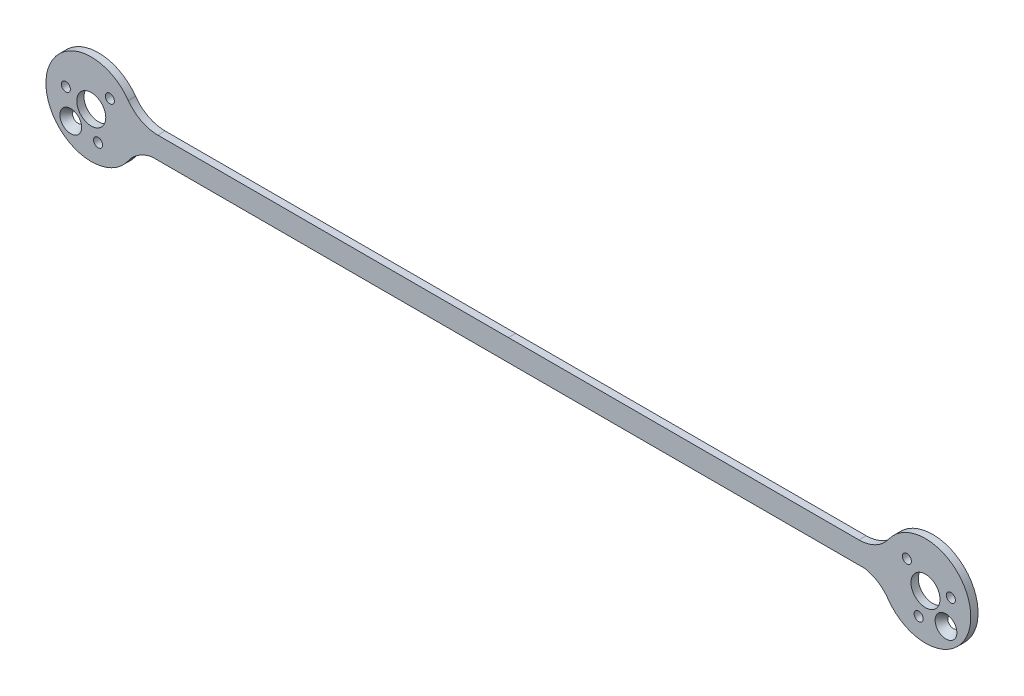
ISO-10303-21;
HEADER;
FILE_DESCRIPTION(('STEP AP214'),'2;1');
FILE_NAME('part.step','',(''),(''),'','','');
FILE_SCHEMA(('AUTOMOTIVE_DESIGN { 1 0 10303 214 1 1 1 1 }'));
ENDSEC;
DATA;
#1=APPLICATION_CONTEXT('core data for automotive mechanical design processes');
#2=APPLICATION_PROTOCOL_DEFINITION('international standard','automotive_design',2000,#1);
#3=PRODUCT_CONTEXT('',#1,'mechanical');
#4=PRODUCT('Part','Part','',(#3));
#5=PRODUCT_RELATED_PRODUCT_CATEGORY('part','',(#4));
#6=PRODUCT_DEFINITION_FORMATION('','',#4);
#7=PRODUCT_DEFINITION_CONTEXT('part definition',#1,'design');
#8=PRODUCT_DEFINITION('design','',#6,#7);
#9=PRODUCT_DEFINITION_SHAPE('','',#8);
#10=(LENGTH_UNIT() NAMED_UNIT(*) SI_UNIT(.MILLI.,.METRE.));
#11=(NAMED_UNIT(*) PLANE_ANGLE_UNIT() SI_UNIT($,.RADIAN.));
#12=(NAMED_UNIT(*) SI_UNIT($,.STERADIAN.) SOLID_ANGLE_UNIT());
#13=UNCERTAINTY_MEASURE_WITH_UNIT(LENGTH_MEASURE(1.E-05),#10,'distance_accuracy_value','');
#14=(GEOMETRIC_REPRESENTATION_CONTEXT(3) GLOBAL_UNCERTAINTY_ASSIGNED_CONTEXT((#13)) GLOBAL_UNIT_ASSIGNED_CONTEXT((#10,
#11,#12)) REPRESENTATION_CONTEXT('',''));
#15=CARTESIAN_POINT('',(0.,0.,0.));
#16=DIRECTION('',(0.,0.,1.));
#17=DIRECTION('',(1.,0.,0.));
#18=AXIS2_PLACEMENT_3D('',#15,#16,#17);
#19=CARTESIAN_POINT('',(-97.5569979375162,13.0225534607483,2.));
#20=DIRECTION('',(0.,0.,-1.));
#21=DIRECTION('',(-1.,0.,0.));
#22=AXIS2_PLACEMENT_3D('',#19,#20,#21);
#23=CYLINDRICAL_SURFACE('',#22,9.99999999999986);
#24=CARTESIAN_POINT('',(-97.5569979375162,13.0225534607483,0.));
#25=DIRECTION('',(0.,0.,1.));
#26=DIRECTION('',(1.,0.,0.));
#27=AXIS2_PLACEMENT_3D('',#24,#25,#26);
#28=CIRCLE('',#27,9.99999999999986);
#29=CARTESIAN_POINT('',(-105.718905786531,7.24472858765025,0.));
#30=VERTEX_POINT('',#29);
#31=CARTESIAN_POINT('',(-97.556989056457,3.02255346075242,0.));
#32=VERTEX_POINT('',#31);
#33=EDGE_CURVE('E174',#30,#32,#28,.T.);
#34=ORIENTED_EDGE('',*,*,#33,.F.);
#35=DIRECTION('',(0.,0.,-1.));
#36=VECTOR('',#35,1.);
#37=CARTESIAN_POINT('',(-105.718905786531,7.24472858765025,2.));
#38=LINE('',#37,#36);
#39=CARTESIAN_POINT('',(-105.718905786531,7.24472858765025,2.));
#40=VERTEX_POINT('',#39);
#41=EDGE_CURVE('E100',#40,#30,#38,.T.);
#42=ORIENTED_EDGE('',*,*,#41,.F.);
#43=CARTESIAN_POINT('',(-97.5569979375162,13.0225534607483,2.));
#44=DIRECTION('',(0.,0.,1.));
#45=DIRECTION('',(1.,0.,0.));
#46=AXIS2_PLACEMENT_3D('',#43,#44,#45);
#47=CIRCLE('',#46,9.99999999999986);
#48=CARTESIAN_POINT('',(-97.556989056457,3.02255346075242,2.));
#49=VERTEX_POINT('',#48);
#50=EDGE_CURVE('E315',#40,#49,#47,.T.);
#51=ORIENTED_EDGE('',*,*,#50,.T.);
#52=DIRECTION('',(0.,0.,-1.));
#53=VECTOR('',#52,1.);
#54=CARTESIAN_POINT('',(-97.556989056457,3.02255346075242,2.));
#55=LINE('',#54,#53);
#56=EDGE_CURVE('E96',#49,#32,#55,.T.);
#57=ORIENTED_EDGE('',*,*,#56,.T.);
#58=EDGE_LOOP('',(#34,#42,#51,#57));
#59=FACE_BOUND('',#58,.T.);
#60=ADVANCED_FACE('F37',(#59),#23,.F.);
#61=CARTESIAN_POINT('',(-115.921163948581,0.0225371514186672,2.));
#62=DIRECTION('',(0.,0.,-1.));
#63=DIRECTION('',(-1.,0.,0.));
#64=AXIS2_PLACEMENT_3D('',#61,#62,#63);
#65=CYLINDRICAL_SURFACE('',#64,12.4998448289046);
#66=CARTESIAN_POINT('',(-115.921163948581,0.0225371514186672,0.));
#67=DIRECTION('',(0.,0.,1.));
#68=DIRECTION('',(1.,0.,0.));
#69=AXIS2_PLACEMENT_3D('',#66,#67,#68);
#70=CIRCLE('',#69,12.4998448289046);
#71=CARTESIAN_POINT('',(-105.660502287007,-7.11643637517478,0.));
#72=VERTEX_POINT('',#71);
#73=EDGE_CURVE('E176',#30,#72,#70,.T.);
#74=ORIENTED_EDGE('',*,*,#73,.T.);
#75=DIRECTION('',(0.,0.,-1.));
#76=VECTOR('',#75,1.);
#77=CARTESIAN_POINT('',(-105.660502287007,-7.11643637517478,2.));
#78=LINE('',#77,#76);
#79=CARTESIAN_POINT('',(-105.660502287007,-7.11643637517478,2.));
#80=VERTEX_POINT('',#79);
#81=EDGE_CURVE('E217',#80,#72,#78,.T.);
#82=ORIENTED_EDGE('',*,*,#81,.F.);
#83=CARTESIAN_POINT('',(-115.921163948581,0.0225371514186672,2.));
#84=DIRECTION('',(0.,0.,1.));
#85=DIRECTION('',(1.,0.,0.));
#86=AXIS2_PLACEMENT_3D('',#83,#84,#85);
#87=CIRCLE('',#86,12.4998448289046);
#88=EDGE_CURVE('E312',#40,#80,#87,.T.);
#89=ORIENTED_EDGE('',*,*,#88,.F.);
#90=ORIENTED_EDGE('',*,*,#41,.T.);
#91=EDGE_LOOP('',(#74,#82,#89,#90));
#92=FACE_BOUND('',#91,.T.);
#93=ADVANCED_FACE('F243',(#92),#65,.T.);
#94=CARTESIAN_POINT('',(-97.4518710583645,-12.8276860941199,2.));
#95=DIRECTION('',(0.,0.,-1.));
#96=DIRECTION('',(-1.,0.,0.));
#97=AXIS2_PLACEMENT_3D('',#94,#95,#96);
#98=CYLINDRICAL_SURFACE('',#97,9.99999999999994);
#99=CARTESIAN_POINT('',(-97.4518710583645,-12.8276860941199,0.));
#100=DIRECTION('',(0.,0.,1.));
#101=DIRECTION('',(1.,0.,0.));
#102=AXIS2_PLACEMENT_3D('',#99,#100,#101);
#103=CIRCLE('',#102,9.99999999999994);
#104=CARTESIAN_POINT('',(-99.1760546445944,-2.97744797715167,0.));
#105=VERTEX_POINT('',#104);
#106=EDGE_CURVE('E179',#105,#72,#103,.T.);
#107=ORIENTED_EDGE('',*,*,#106,.F.);
#108=DIRECTION('',(0.,0.,-1.));
#109=VECTOR('',#108,1.);
#110=CARTESIAN_POINT('',(-99.1760546445944,-2.97744797715167,2.));
#111=LINE('',#110,#109);
#112=CARTESIAN_POINT('',(-99.1760546445944,-2.97744797715167,2.));
#113=VERTEX_POINT('',#112);
#114=EDGE_CURVE('E215',#113,#105,#111,.T.);
#115=ORIENTED_EDGE('',*,*,#114,.F.);
#116=CARTESIAN_POINT('',(-97.4518710583645,-12.8276860941199,2.));
#117=DIRECTION('',(0.,0.,1.));
#118=DIRECTION('',(1.,0.,0.));
#119=AXIS2_PLACEMENT_3D('',#116,#117,#118);
#120=CIRCLE('',#119,9.99999999999994);
#121=EDGE_CURVE('E314',#113,#80,#120,.T.);
#122=ORIENTED_EDGE('',*,*,#121,.T.);
#123=ORIENTED_EDGE('',*,*,#81,.T.);
#124=EDGE_LOOP('',(#107,#115,#122,#123));
#125=FACE_BOUND('',#124,.T.);
#126=ADVANCED_FACE('F248',(#125),#98,.F.);
#127=CARTESIAN_POINT('',(2.64421095709354E-06,-2.97735989830789,2.));
#128=DIRECTION('',(-8.8810592182533E-07,0.999999999999606,0.));
#129=DIRECTION('',(-0.999999999999606,-8.88105921825331E-07,0.));
#130=AXIS2_PLACEMENT_3D('',#127,#128,#129);
#131=PLANE('',#130);
#132=DIRECTION('',(0.999999999999606,8.8810592182533E-07,0.));
#133=VECTOR('',#132,1.);
#134=CARTESIAN_POINT('',(2.64421095709354E-06,-2.97735989830789,0.));
#135=LINE('',#134,#133);
#136=CARTESIAN_POINT('',(-0.921276729477011,-2.97736071650156,0.));
#137=VERTEX_POINT('',#136);
#138=EDGE_CURVE('E182',#105,#137,#135,.T.);
#139=ORIENTED_EDGE('',*,*,#138,.T.);
#140=DIRECTION('',(0.,0.,-1.));
#141=VECTOR('',#140,1.);
#142=CARTESIAN_POINT('',(-0.921276729477011,-2.97736071650156,2.));
#143=LINE('',#142,#141);
#144=CARTESIAN_POINT('',(-0.921276729477011,-2.97736071650156,2.));
#145=VERTEX_POINT('',#144);
#146=EDGE_CURVE('E212',#145,#137,#143,.T.);
#147=ORIENTED_EDGE('',*,*,#146,.F.);
#148=DIRECTION('',(0.999999999999606,8.8810592182533E-07,0.));
#149=VECTOR('',#148,1.);
#150=CARTESIAN_POINT('',(2.64421095709354E-06,-2.97735989830789,2.));
#151=LINE('',#150,#149);
#152=EDGE_CURVE('E325',#113,#145,#151,.T.);
#153=ORIENTED_EDGE('',*,*,#152,.F.);
#154=ORIENTED_EDGE('',*,*,#114,.T.);
#155=EDGE_LOOP('',(#139,#147,#153,#154));
#156=FACE_BOUND('',#155,.T.);
#157=ADVANCED_FACE('F353',(#156),#131,.F.);
#158=CARTESIAN_POINT('',(3.42803572160413E-06,-2.97735965576934,2.));
#159=DIRECTION('',(-1.15136769417804E-06,0.999999999999337,0.));
#160=DIRECTION('',(-0.999999999999337,-1.15136769417804E-06,0.));
#161=AXIS2_PLACEMENT_3D('',#158,#159,#160);
#162=PLANE('',#161);
#163=DIRECTION('',(0.999999999999337,1.15136769417804E-06,0.));
#164=VECTOR('',#163,1.);
#165=CARTESIAN_POINT('',(3.42803572160413E-06,-2.97735965576934,0.));
#166=LINE('',#165,#164);
#167=CARTESIAN_POINT('',(97.333501185614,-2.97724758912446,0.));
#168=VERTEX_POINT('',#167);
#169=EDGE_CURVE('E185',#137,#168,#166,.T.);
#170=ORIENTED_EDGE('',*,*,#169,.T.);
#171=DIRECTION('',(0.,0.,-1.));
#172=VECTOR('',#171,1.);
#173=CARTESIAN_POINT('',(97.333501185614,-2.97724758912446,2.));
#174=LINE('',#173,#172);
#175=CARTESIAN_POINT('',(97.333501185614,-2.97724758912446,2.));
#176=VERTEX_POINT('',#175);
#177=EDGE_CURVE('E210',#176,#168,#174,.T.);
#178=ORIENTED_EDGE('',*,*,#177,.F.);
#179=DIRECTION('',(0.999999999999337,1.15136769417804E-06,0.));
#180=VECTOR('',#179,1.);
#181=CARTESIAN_POINT('',(3.42803572160413E-06,-2.97735965576934,2.));
#182=LINE('',#181,#180);
#183=EDGE_CURVE('E328',#145,#176,#182,.T.);
#184=ORIENTED_EDGE('',*,*,#183,.F.);
#185=ORIENTED_EDGE('',*,*,#146,.T.);
#186=EDGE_LOOP('',(#170,#178,#184,#185));
#187=FACE_BOUND('',#186,.T.);
#188=ADVANCED_FACE('F337',(#187),#162,.F.);
#189=CARTESIAN_POINT('',(95.6093376886885,-12.8274892224992,2.));
#190=DIRECTION('',(0.,0.,-1.));
#191=DIRECTION('',(-1.,0.,0.));
#192=AXIS2_PLACEMENT_3D('',#189,#190,#191);
#193=CYLINDRICAL_SURFACE('',#192,9.99999999999995);
#194=CARTESIAN_POINT('',(95.6093376886885,-12.8274892224992,0.));
#195=DIRECTION('',(0.,0.,1.));
#196=DIRECTION('',(1.,0.,0.));
#197=AXIS2_PLACEMENT_3D('',#194,#195,#196);
#198=CIRCLE('',#197,9.99999999999995);
#199=CARTESIAN_POINT('',(103.817957269371,-7.11622276227923,0.));
#200=VERTEX_POINT('',#199);
#201=EDGE_CURVE('E188',#200,#168,#198,.T.);
#202=ORIENTED_EDGE('',*,*,#201,.F.);
#203=DIRECTION('',(0.,0.,-1.));
#204=VECTOR('',#203,1.);
#205=CARTESIAN_POINT('',(103.817957269371,-7.11622276227923,2.));
#206=LINE('',#205,#204);
#207=CARTESIAN_POINT('',(103.817957269371,-7.11622276227923,2.));
#208=VERTEX_POINT('',#207);
#209=EDGE_CURVE('E208',#208,#200,#206,.T.);
#210=ORIENTED_EDGE('',*,*,#209,.F.);
#211=CARTESIAN_POINT('',(95.6093376886885,-12.8274892224992,2.));
#212=DIRECTION('',(0.,0.,1.));
#213=DIRECTION('',(1.,0.,0.));
#214=AXIS2_PLACEMENT_3D('',#211,#212,#213);
#215=CIRCLE('',#214,9.99999999999995);
#216=EDGE_CURVE('E145',#208,#176,#215,.T.);
#217=ORIENTED_EDGE('',*,*,#216,.T.);
#218=ORIENTED_EDGE('',*,*,#177,.T.);
#219=EDGE_LOOP('',(#202,#210,#217,#218));
#220=FACE_BOUND('',#219,.T.);
#221=ADVANCED_FACE('F332',(#220),#193,.F.);
#222=CARTESIAN_POINT('',(114.078604371175,0.0227716906485944,2.));
#223=DIRECTION('',(0.,0.,-1.));
#224=DIRECTION('',(-1.,0.,0.));
#225=AXIS2_PLACEMENT_3D('',#222,#223,#224);
#226=CYLINDRICAL_SURFACE('',#225,12.4998448289045);
#227=CARTESIAN_POINT('',(114.078604371175,0.0227716906485944,0.));
#228=DIRECTION('',(0.,0.,1.));
#229=DIRECTION('',(1.,0.,0.));
#230=AXIS2_PLACEMENT_3D('',#227,#228,#229);
#231=CIRCLE('',#230,12.4998448289045);
#232=CARTESIAN_POINT('',(103.876331479677,7.2449423196281,0.));
#233=VERTEX_POINT('',#232);
#234=EDGE_CURVE('E191',#200,#233,#231,.T.);
#235=ORIENTED_EDGE('',*,*,#234,.T.);
#236=DIRECTION('',(0.,0.,-1.));
#237=VECTOR('',#236,1.);
#238=CARTESIAN_POINT('',(103.876331479677,7.2449423196281,2.));
#239=LINE('',#238,#237);
#240=CARTESIAN_POINT('',(103.876331479677,7.2449423196281,2.));
#241=VERTEX_POINT('',#240);
#242=EDGE_CURVE('E132',#241,#233,#239,.T.);
#243=ORIENTED_EDGE('',*,*,#242,.F.);
#244=CARTESIAN_POINT('',(114.078604371175,0.0227716906485944,2.));
#245=DIRECTION('',(0.,0.,1.));
#246=DIRECTION('',(1.,0.,0.));
#247=AXIS2_PLACEMENT_3D('',#244,#245,#246);
#248=CIRCLE('',#247,12.4998448289045);
#249=EDGE_CURVE('E142',#208,#241,#248,.T.);
#250=ORIENTED_EDGE('',*,*,#249,.F.);
#251=ORIENTED_EDGE('',*,*,#209,.T.);
#252=EDGE_LOOP('',(#235,#243,#250,#251));
#253=FACE_BOUND('',#252,.T.);
#254=ADVANCED_FACE('F340',(#253),#226,.T.);
#255=CARTESIAN_POINT('',(95.7144118469584,13.0227505467189,2.));
#256=DIRECTION('',(0.,0.,-1.));
#257=DIRECTION('',(-1.,0.,0.));
#258=AXIS2_PLACEMENT_3D('',#255,#256,#257);
#259=CYLINDRICAL_SURFACE('',#258,10.0000000000002);
#260=CARTESIAN_POINT('',(95.7144118469584,13.0227505467189,0.));
#261=DIRECTION('',(0.,0.,1.));
#262=DIRECTION('',(1.,0.,0.));
#263=AXIS2_PLACEMENT_3D('',#260,#261,#262);
#264=CIRCLE('',#263,10.0000000000002);
#265=CARTESIAN_POINT('',(95.7144233606354,3.02275054672531,0.));
#266=VERTEX_POINT('',#265);
#267=EDGE_CURVE('E129',#266,#233,#264,.T.);
#268=ORIENTED_EDGE('',*,*,#267,.F.);
#269=DIRECTION('',(0.,0.,-1.));
#270=VECTOR('',#269,1.);
#271=CARTESIAN_POINT('',(95.7144233606354,3.02275054672531,2.));
#272=LINE('',#271,#270);
#273=CARTESIAN_POINT('',(95.7144233606354,3.02275054672531,2.));
#274=VERTEX_POINT('',#273);
#275=EDGE_CURVE('E123',#274,#266,#272,.T.);
#276=ORIENTED_EDGE('',*,*,#275,.F.);
#277=CARTESIAN_POINT('',(95.7144118469584,13.0227505467189,2.));
#278=DIRECTION('',(0.,0.,1.));
#279=DIRECTION('',(1.,0.,0.));
#280=AXIS2_PLACEMENT_3D('',#277,#278,#279);
#281=CIRCLE('',#280,10.0000000000002);
#282=EDGE_CURVE('E127',#274,#241,#281,.T.);
#283=ORIENTED_EDGE('',*,*,#282,.T.);
#284=ORIENTED_EDGE('',*,*,#242,.T.);
#285=EDGE_LOOP('',(#268,#276,#283,#284));
#286=FACE_BOUND('',#285,.T.);
#287=ADVANCED_FACE('F125',(#286),#259,.F.);
#288=CARTESIAN_POINT('',(-3.48017043396168E-06,3.02264034422668,2.));
#289=DIRECTION('',(1.15136769103429E-06,-0.999999999999337,0.));
#290=DIRECTION('',(0.999999999999337,1.15136769103429E-06,0.));
#291=AXIS2_PLACEMENT_3D('',#288,#289,#290);
#292=PLANE('',#291);
#293=DIRECTION('',(-0.999999999999337,-1.15136769103429E-06,0.));
#294=VECTOR('',#293,1.);
#295=CARTESIAN_POINT('',(-3.48017043396168E-06,3.02264034422668,0.));
#296=LINE('',#295,#294);
#297=CARTESIAN_POINT('',(-0.921282847897899,3.02263928349538,0.));
#298=VERTEX_POINT('',#297);
#299=EDGE_CURVE('E195',#266,#298,#296,.T.);
#300=ORIENTED_EDGE('',*,*,#299,.T.);
#301=DIRECTION('',(0.,0.,-1.));
#302=VECTOR('',#301,1.);
#303=CARTESIAN_POINT('',(-0.921282847897899,3.02263928349538,2.));
#304=LINE('',#303,#302);
#305=CARTESIAN_POINT('',(-0.921282847897899,3.02263928349538,2.));
#306=VERTEX_POINT('',#305);
#307=EDGE_CURVE('E133',#306,#298,#304,.T.);
#308=ORIENTED_EDGE('',*,*,#307,.F.);
#309=DIRECTION('',(-0.999999999999337,-1.15136769103429E-06,0.));
#310=VECTOR('',#309,1.);
#311=CARTESIAN_POINT('',(-3.48017043396168E-06,3.02264034422668,2.));
#312=LINE('',#311,#310);
#313=EDGE_CURVE('E136',#274,#306,#312,.T.);
#314=ORIENTED_EDGE('',*,*,#313,.F.);
#315=ORIENTED_EDGE('',*,*,#275,.T.);
#316=EDGE_LOOP('',(#300,#308,#314,#315));
#317=FACE_BOUND('',#316,.T.);
#318=ADVANCED_FACE('F137',(#317),#292,.F.);
#319=CARTESIAN_POINT('',(-2.68442457423679E-06,3.02264010168975,2.));
#320=DIRECTION('',(8.88105921950502E-07,-0.999999999999606,0.));
#321=DIRECTION('',(0.999999999999606,8.88105921950502E-07,0.));
#322=AXIS2_PLACEMENT_3D('',#319,#320,#321);
#323=PLANE('',#322);
#324=DIRECTION('',(-0.999999999999606,-8.88105921950502E-07,0.));
#325=VECTOR('',#324,1.);
#326=CARTESIAN_POINT('',(-2.68442457423679E-06,3.02264010168975,0.));
#327=LINE('',#326,#325);
#328=EDGE_CURVE('E89',#298,#32,#327,.T.);
#329=ORIENTED_EDGE('',*,*,#328,.T.);
#330=ORIENTED_EDGE('',*,*,#56,.F.);
#331=DIRECTION('',(-0.999999999999606,-8.88105921950502E-07,0.));
#332=VECTOR('',#331,1.);
#333=CARTESIAN_POINT('',(-2.68442457423679E-06,3.02264010168975,2.));
#334=LINE('',#333,#332);
#335=EDGE_CURVE('E54',#306,#49,#334,.T.);
#336=ORIENTED_EDGE('',*,*,#335,.F.);
#337=ORIENTED_EDGE('',*,*,#307,.T.);
#338=EDGE_LOOP('',(#329,#330,#336,#337));
#339=FACE_BOUND('',#338,.T.);
#340=ADVANCED_FACE('F257',(#339),#323,.F.);
#341=CARTESIAN_POINT('',(108.952197995541,5.14916686781635,2.));
#342=DIRECTION('',(0.,0.,-1.));
#343=DIRECTION('',(-1.,0.,0.));
#344=AXIS2_PLACEMENT_3D('',#341,#342,#343);
#345=CYLINDRICAL_SURFACE('',#344,1.25);
#346=CARTESIAN_POINT('',(108.952197995541,5.14916686781635,2.));
#347=DIRECTION('',(0.,0.,1.));
#348=DIRECTION('',(1.,0.,0.));
#349=AXIS2_PLACEMENT_3D('',#346,#347,#348);
#350=CIRCLE('',#349,1.25);
#351=CARTESIAN_POINT('',(110.202197995541,5.14916686781635,2.));
#352=VERTEX_POINT('',#351);
#353=EDGE_CURVE('E317',#352,#352,#350,.T.);
#354=ORIENTED_EDGE('',*,*,#353,.T.);
#355=EDGE_LOOP('',(#354));
#356=FACE_BOUND('',#355,.T.);
#357=CARTESIAN_POINT('',(108.952197995541,5.14916686781635,0.));
#358=DIRECTION('',(0.,0.,1.));
#359=DIRECTION('',(1.,0.,0.));
#360=AXIS2_PLACEMENT_3D('',#357,#358,#359);
#361=CIRCLE('',#360,1.25);
#362=CARTESIAN_POINT('',(110.202197995541,5.14916686781635,0.));
#363=VERTEX_POINT('',#362);
#364=EDGE_CURVE('E171',#363,#363,#361,.T.);
#365=ORIENTED_EDGE('',*,*,#364,.F.);
#366=EDGE_LOOP('',(#365));
#367=FACE_BOUND('',#366,.T.);
#368=ADVANCED_FACE('F253',(#356,#367),#345,.F.);
#369=CARTESIAN_POINT('',(-114.044839763862,-6.9803195363818,2.));
#370=DIRECTION('',(0.,0.,-1.));
#371=DIRECTION('',(-1.,0.,0.));
#372=AXIS2_PLACEMENT_3D('',#369,#370,#371);
#373=CYLINDRICAL_SURFACE('',#372,1.24999999999999);
#374=CARTESIAN_POINT('',(-114.044839763862,-6.9803195363818,2.));
#375=DIRECTION('',(0.,0.,1.));
#376=DIRECTION('',(1.,0.,0.));
#377=AXIS2_PLACEMENT_3D('',#374,#375,#376);
#378=CIRCLE('',#377,1.24999999999999);
#379=CARTESIAN_POINT('',(-112.794839763862,-6.9803195363818,2.));
#380=VERTEX_POINT('',#379);
#381=EDGE_CURVE('E320',#380,#380,#378,.T.);
#382=ORIENTED_EDGE('',*,*,#381,.T.);
#383=EDGE_LOOP('',(#382));
#384=FACE_BOUND('',#383,.T.);
#385=CARTESIAN_POINT('',(-114.044839763862,-6.9803195363818,0.));
#386=DIRECTION('',(0.,0.,1.));
#387=DIRECTION('',(1.,0.,0.));
#388=AXIS2_PLACEMENT_3D('',#385,#386,#387);
#389=CIRCLE('',#388,1.24999999999999);
#390=CARTESIAN_POINT('',(-112.794839763862,-6.9803195363818,0.));
#391=VERTEX_POINT('',#390);
#392=EDGE_CURVE('E168',#391,#391,#389,.T.);
#393=ORIENTED_EDGE('',*,*,#392,.F.);
#394=EDGE_LOOP('',(#393));
#395=FACE_BOUND('',#394,.T.);
#396=ADVANCED_FACE('F256',(#384,#395),#373,.F.);
#397=CARTESIAN_POINT('',(121.081684399739,1.89908078120717,2.));
#398=DIRECTION('',(0.,0.,-1.));
#399=DIRECTION('',(-1.,0.,0.));
#400=AXIS2_PLACEMENT_3D('',#397,#398,#399);
#401=CYLINDRICAL_SURFACE('',#400,1.25);
#402=CARTESIAN_POINT('',(121.081684399739,1.89908078120717,2.));
#403=DIRECTION('',(0.,0.,1.));
#404=DIRECTION('',(1.,0.,0.));
#405=AXIS2_PLACEMENT_3D('',#402,#403,#404);
#406=CIRCLE('',#405,1.25);
#407=CARTESIAN_POINT('',(122.331684399739,1.89908078120717,2.));
#408=VERTEX_POINT('',#407);
#409=EDGE_CURVE('E500',#408,#408,#406,.T.);
#410=ORIENTED_EDGE('',*,*,#409,.T.);
#411=EDGE_LOOP('',(#410));
#412=FACE_BOUND('',#411,.T.);
#413=CARTESIAN_POINT('',(121.081684399739,1.89908078120717,0.));
#414=DIRECTION('',(0.,0.,1.));
#415=DIRECTION('',(1.,0.,0.));
#416=AXIS2_PLACEMENT_3D('',#413,#414,#415);
#417=CIRCLE('',#416,1.25);
#418=CARTESIAN_POINT('',(122.331684399739,1.89908078120717,0.));
#419=VERTEX_POINT('',#418);
#420=EDGE_CURVE('E165',#419,#419,#417,.T.);
#421=ORIENTED_EDGE('',*,*,#420,.F.);
#422=EDGE_LOOP('',(#421));
#423=FACE_BOUND('',#422,.T.);
#424=ADVANCED_FACE('F261',(#412,#423),#401,.F.);
#425=CARTESIAN_POINT('',(-122.924240081451,1.89908078120717,2.));
#426=DIRECTION('',(0.,0.,-1.));
#427=DIRECTION('',(-1.,0.,0.));
#428=AXIS2_PLACEMENT_3D('',#425,#426,#427);
#429=CYLINDRICAL_SURFACE('',#428,1.24999999999999);
#430=CARTESIAN_POINT('',(-122.924240081451,1.89908078120717,2.));
#431=DIRECTION('',(0.,0.,1.));
#432=DIRECTION('',(1.,0.,0.));
#433=AXIS2_PLACEMENT_3D('',#430,#431,#432);
#434=CIRCLE('',#433,1.24999999999999);
#435=CARTESIAN_POINT('',(-121.674240081451,1.89908078120717,2.));
#436=VERTEX_POINT('',#435);
#437=EDGE_CURVE('E503',#436,#436,#434,.T.);
#438=ORIENTED_EDGE('',*,*,#437,.T.);
#439=EDGE_LOOP('',(#438));
#440=FACE_BOUND('',#439,.T.);
#441=CARTESIAN_POINT('',(-122.924240081451,1.89908078120717,0.));
#442=DIRECTION('',(0.,0.,1.));
#443=DIRECTION('',(1.,0.,0.));
#444=AXIS2_PLACEMENT_3D('',#441,#442,#443);
#445=CIRCLE('',#444,1.24999999999999);
#446=CARTESIAN_POINT('',(-121.674240081451,1.89908078120717,0.));
#447=VERTEX_POINT('',#446);
#448=EDGE_CURVE('E162',#447,#447,#445,.T.);
#449=ORIENTED_EDGE('',*,*,#448,.F.);
#450=EDGE_LOOP('',(#449));
#451=FACE_BOUND('',#450,.T.);
#452=ADVANCED_FACE('F265',(#440,#451),#429,.F.);
#453=CARTESIAN_POINT('',(-110.794753677253,5.14916686781635,2.));
#454=DIRECTION('',(0.,0.,-1.));
#455=DIRECTION('',(-1.,0.,0.));
#456=AXIS2_PLACEMENT_3D('',#453,#454,#455);
#457=CYLINDRICAL_SURFACE('',#456,1.24999999999999);
#458=CARTESIAN_POINT('',(-110.794753677253,5.14916686781635,2.));
#459=DIRECTION('',(0.,0.,1.));
#460=DIRECTION('',(1.,0.,0.));
#461=AXIS2_PLACEMENT_3D('',#458,#459,#460);
#462=CIRCLE('',#461,1.24999999999999);
#463=CARTESIAN_POINT('',(-109.544753677253,5.14916686781635,2.));
#464=VERTEX_POINT('',#463);
#465=EDGE_CURVE('E506',#464,#464,#462,.T.);
#466=ORIENTED_EDGE('',*,*,#465,.T.);
#467=EDGE_LOOP('',(#466));
#468=FACE_BOUND('',#467,.T.);
#469=CARTESIAN_POINT('',(-110.794753677253,5.14916686781635,0.));
#470=DIRECTION('',(0.,0.,1.));
#471=DIRECTION('',(1.,0.,0.));
#472=AXIS2_PLACEMENT_3D('',#469,#470,#471);
#473=CIRCLE('',#472,1.24999999999999);
#474=CARTESIAN_POINT('',(-109.544753677253,5.14916686781635,0.));
#475=VERTEX_POINT('',#474);
#476=EDGE_CURVE('E159',#475,#475,#473,.T.);
#477=ORIENTED_EDGE('',*,*,#476,.F.);
#478=EDGE_LOOP('',(#477));
#479=FACE_BOUND('',#478,.T.);
#480=ADVANCED_FACE('F269',(#468,#479),#457,.F.);
#481=CARTESIAN_POINT('',(114.078604371175,0.0227716906485944,2.));
#482=DIRECTION('',(0.,0.,-1.));
#483=DIRECTION('',(-1.,0.,0.));
#484=AXIS2_PLACEMENT_3D('',#481,#482,#483);
#485=CYLINDRICAL_SURFACE('',#484,4.00000000000003);
#486=CARTESIAN_POINT('',(114.078604371175,0.0227716906485944,2.));
#487=DIRECTION('',(0.,0.,1.));
#488=DIRECTION('',(1.,0.,0.));
#489=AXIS2_PLACEMENT_3D('',#486,#487,#488);
#490=CIRCLE('',#489,4.00000000000003);
#491=CARTESIAN_POINT('',(118.078604371175,0.0227716906485944,2.));
#492=VERTEX_POINT('',#491);
#493=EDGE_CURVE('E509',#492,#492,#490,.T.);
#494=ORIENTED_EDGE('',*,*,#493,.T.);
#495=EDGE_LOOP('',(#494));
#496=FACE_BOUND('',#495,.T.);
#497=CARTESIAN_POINT('',(114.078604371175,0.0227716906485944,0.));
#498=DIRECTION('',(0.,0.,1.));
#499=DIRECTION('',(1.,0.,0.));
#500=AXIS2_PLACEMENT_3D('',#497,#498,#499);
#501=CIRCLE('',#500,4.00000000000003);
#502=CARTESIAN_POINT('',(118.078604371175,0.0227716906485944,0.));
#503=VERTEX_POINT('',#502);
#504=EDGE_CURVE('E156',#503,#503,#501,.T.);
#505=ORIENTED_EDGE('',*,*,#504,.F.);
#506=EDGE_LOOP('',(#505));
#507=FACE_BOUND('',#506,.T.);
#508=ADVANCED_FACE('F273',(#496,#507),#485,.F.);
#509=CARTESIAN_POINT('',(112.20228408215,-6.9803195363818,2.));
#510=DIRECTION('',(0.,0.,-1.));
#511=DIRECTION('',(-1.,0.,0.));
#512=AXIS2_PLACEMENT_3D('',#509,#510,#511);
#513=CYLINDRICAL_SURFACE('',#512,1.25);
#514=CARTESIAN_POINT('',(112.20228408215,-6.9803195363818,2.));
#515=DIRECTION('',(0.,0.,1.));
#516=DIRECTION('',(1.,0.,0.));
#517=AXIS2_PLACEMENT_3D('',#514,#515,#516);
#518=CIRCLE('',#517,1.25);
#519=CARTESIAN_POINT('',(113.45228408215,-6.9803195363818,2.));
#520=VERTEX_POINT('',#519);
#521=EDGE_CURVE('E512',#520,#520,#518,.T.);
#522=ORIENTED_EDGE('',*,*,#521,.T.);
#523=EDGE_LOOP('',(#522));
#524=FACE_BOUND('',#523,.T.);
#525=CARTESIAN_POINT('',(112.20228408215,-6.9803195363818,0.));
#526=DIRECTION('',(0.,0.,1.));
#527=DIRECTION('',(1.,0.,0.));
#528=AXIS2_PLACEMENT_3D('',#525,#526,#527);
#529=CIRCLE('',#528,1.25);
#530=CARTESIAN_POINT('',(113.45228408215,-6.9803195363818,0.));
#531=VERTEX_POINT('',#530);
#532=EDGE_CURVE('E153',#531,#531,#529,.T.);
#533=ORIENTED_EDGE('',*,*,#532,.F.);
#534=EDGE_LOOP('',(#533));
#535=FACE_BOUND('',#534,.T.);
#536=ADVANCED_FACE('F277',(#524,#535),#513,.F.);
#537=CARTESIAN_POINT('',(-115.921163948581,0.0225371514186672,2.));
#538=DIRECTION('',(0.,0.,-1.));
#539=DIRECTION('',(-1.,0.,0.));
#540=AXIS2_PLACEMENT_3D('',#537,#538,#539);
#541=CYLINDRICAL_SURFACE('',#540,3.99999999999989);
#542=CARTESIAN_POINT('',(-115.921163948581,0.0225371514186672,2.));
#543=DIRECTION('',(0.,0.,1.));
#544=DIRECTION('',(1.,0.,0.));
#545=AXIS2_PLACEMENT_3D('',#542,#543,#544);
#546=CIRCLE('',#545,3.99999999999989);
#547=CARTESIAN_POINT('',(-111.921163948581,0.0225371514186672,2.));
#548=VERTEX_POINT('',#547);
#549=EDGE_CURVE('E204',#548,#548,#546,.T.);
#550=ORIENTED_EDGE('',*,*,#549,.T.);
#551=EDGE_LOOP('',(#550));
#552=FACE_BOUND('',#551,.T.);
#553=CARTESIAN_POINT('',(-115.921163948581,0.0225371514186672,0.));
#554=DIRECTION('',(0.,0.,1.));
#555=DIRECTION('',(1.,0.,0.));
#556=AXIS2_PLACEMENT_3D('',#553,#554,#555);
#557=CIRCLE('',#556,3.99999999999989);
#558=CARTESIAN_POINT('',(-111.921163948581,0.0225371514186672,0.));
#559=VERTEX_POINT('',#558);
#560=EDGE_CURVE('E150',#559,#559,#557,.T.);
#561=ORIENTED_EDGE('',*,*,#560,.F.);
#562=EDGE_LOOP('',(#561));
#563=FACE_BOUND('',#562,.T.);
#564=ADVANCED_FACE('F280',(#552,#563),#541,.F.);
#565=CARTESIAN_POINT('',(0.,0.,2.));
#566=DIRECTION('',(0.,0.,1.));
#567=DIRECTION('',(1.,0.,0.));
#568=AXIS2_PLACEMENT_3D('',#565,#566,#567);
#569=PLANE('',#568);
#570=CARTESIAN_POINT('',(-121.578132090348,-5.63421154527845,2.));
#571=DIRECTION('',(0.,0.,1.));
#572=DIRECTION('',(1.,0.,0.));
#573=AXIS2_PLACEMENT_3D('',#570,#571,#572);
#574=CIRCLE('',#573,2.99999999999998);
#575=CARTESIAN_POINT('',(-118.578132090348,-5.63421154527845,2.));
#576=VERTEX_POINT('',#575);
#577=EDGE_CURVE('E11',#576,#576,#574,.F.);
#578=ORIENTED_EDGE('',*,*,#577,.T.);
#579=EDGE_LOOP('',(#578));
#580=FACE_BOUND('',#579,.T.);
#581=CARTESIAN_POINT('',(119.735576408636,-5.63421154527845,2.));
#582=DIRECTION('',(0.,0.,1.));
#583=DIRECTION('',(1.,0.,0.));
#584=AXIS2_PLACEMENT_3D('',#581,#582,#583);
#585=CIRCLE('',#584,2.99999999999998);
#586=CARTESIAN_POINT('',(122.735576408636,-5.63421154527845,2.));
#587=VERTEX_POINT('',#586);
#588=EDGE_CURVE('E46',#587,#587,#585,.F.);
#589=ORIENTED_EDGE('',*,*,#588,.T.);
#590=EDGE_LOOP('',(#589));
#591=FACE_BOUND('',#590,.T.);
#592=ORIENTED_EDGE('',*,*,#549,.F.);
#593=EDGE_LOOP('',(#592));
#594=FACE_BOUND('',#593,.T.);
#595=ORIENTED_EDGE('',*,*,#521,.F.);
#596=EDGE_LOOP('',(#595));
#597=FACE_BOUND('',#596,.T.);
#598=ORIENTED_EDGE('',*,*,#493,.F.);
#599=EDGE_LOOP('',(#598));
#600=FACE_BOUND('',#599,.T.);
#601=ORIENTED_EDGE('',*,*,#465,.F.);
#602=EDGE_LOOP('',(#601));
#603=FACE_BOUND('',#602,.T.);
#604=ORIENTED_EDGE('',*,*,#437,.F.);
#605=EDGE_LOOP('',(#604));
#606=FACE_BOUND('',#605,.T.);
#607=ORIENTED_EDGE('',*,*,#409,.F.);
#608=EDGE_LOOP('',(#607));
#609=FACE_BOUND('',#608,.T.);
#610=ORIENTED_EDGE('',*,*,#381,.F.);
#611=EDGE_LOOP('',(#610));
#612=FACE_BOUND('',#611,.T.);
#613=ORIENTED_EDGE('',*,*,#353,.F.);
#614=EDGE_LOOP('',(#613));
#615=FACE_BOUND('',#614,.T.);
#616=ORIENTED_EDGE('',*,*,#50,.F.);
#617=ORIENTED_EDGE('',*,*,#88,.T.);
#618=ORIENTED_EDGE('',*,*,#121,.F.);
#619=ORIENTED_EDGE('',*,*,#152,.T.);
#620=ORIENTED_EDGE('',*,*,#183,.T.);
#621=ORIENTED_EDGE('',*,*,#216,.F.);
#622=ORIENTED_EDGE('',*,*,#249,.T.);
#623=ORIENTED_EDGE('',*,*,#282,.F.);
#624=ORIENTED_EDGE('',*,*,#313,.T.);
#625=ORIENTED_EDGE('',*,*,#335,.T.);
#626=EDGE_LOOP('',(#616,#617,#618,#619,#620,#621,#622,#623,#624,#625));
#627=FACE_BOUND('',#626,.T.);
#628=ADVANCED_FACE('F139',(#580,#591,#594,#597,#600,#603,#606,#609,#612,#615,#627),#569,.T.);
#629=CARTESIAN_POINT('',(0.,0.,0.));
#630=DIRECTION('',(0.,0.,1.));
#631=DIRECTION('',(1.,0.,0.));
#632=AXIS2_PLACEMENT_3D('',#629,#630,#631);
#633=PLANE('',#632);
#634=ORIENTED_EDGE('',*,*,#560,.T.);
#635=EDGE_LOOP('',(#634));
#636=FACE_BOUND('',#635,.T.);
#637=ORIENTED_EDGE('',*,*,#532,.T.);
#638=EDGE_LOOP('',(#637));
#639=FACE_BOUND('',#638,.T.);
#640=ORIENTED_EDGE('',*,*,#504,.T.);
#641=EDGE_LOOP('',(#640));
#642=FACE_BOUND('',#641,.T.);
#643=ORIENTED_EDGE('',*,*,#476,.T.);
#644=EDGE_LOOP('',(#643));
#645=FACE_BOUND('',#644,.T.);
#646=ORIENTED_EDGE('',*,*,#448,.T.);
#647=EDGE_LOOP('',(#646));
#648=FACE_BOUND('',#647,.T.);
#649=ORIENTED_EDGE('',*,*,#420,.T.);
#650=EDGE_LOOP('',(#649));
#651=FACE_BOUND('',#650,.T.);
#652=ORIENTED_EDGE('',*,*,#392,.T.);
#653=EDGE_LOOP('',(#652));
#654=FACE_BOUND('',#653,.T.);
#655=ORIENTED_EDGE('',*,*,#364,.T.);
#656=EDGE_LOOP('',(#655));
#657=FACE_BOUND('',#656,.T.);
#658=ORIENTED_EDGE('',*,*,#33,.T.);
#659=ORIENTED_EDGE('',*,*,#328,.F.);
#660=ORIENTED_EDGE('',*,*,#299,.F.);
#661=ORIENTED_EDGE('',*,*,#267,.T.);
#662=ORIENTED_EDGE('',*,*,#234,.F.);
#663=ORIENTED_EDGE('',*,*,#201,.T.);
#664=ORIENTED_EDGE('',*,*,#169,.F.);
#665=ORIENTED_EDGE('',*,*,#138,.F.);
#666=ORIENTED_EDGE('',*,*,#106,.T.);
#667=ORIENTED_EDGE('',*,*,#73,.F.);
#668=EDGE_LOOP('',(#658,#659,#660,#661,#662,#663,#664,#665,#666,#667));
#669=FACE_BOUND('',#668,.T.);
#670=CARTESIAN_POINT('',(119.735576408636,-5.63421154527845,0.));
#671=DIRECTION('',(0.,0.,1.));
#672=DIRECTION('',(1.,0.,0.));
#673=AXIS2_PLACEMENT_3D('',#670,#671,#672);
#674=CIRCLE('',#673,1.49999999999999);
#675=CARTESIAN_POINT('',(121.235576408636,-5.63421154527845,0.));
#676=VERTEX_POINT('',#675);
#677=EDGE_CURVE('E198',#676,#676,#674,.T.);
#678=ORIENTED_EDGE('',*,*,#677,.T.);
#679=EDGE_LOOP('',(#678));
#680=FACE_BOUND('',#679,.T.);
#681=CARTESIAN_POINT('',(-121.578132090348,-5.63421154527845,0.));
#682=DIRECTION('',(0.,0.,1.));
#683=DIRECTION('',(1.,0.,0.));
#684=AXIS2_PLACEMENT_3D('',#681,#682,#683);
#685=CIRCLE('',#684,1.5);
#686=CARTESIAN_POINT('',(-120.078132090348,-5.63421154527845,0.));
#687=VERTEX_POINT('',#686);
#688=EDGE_CURVE('E201',#687,#687,#685,.T.);
#689=ORIENTED_EDGE('',*,*,#688,.T.);
#690=EDGE_LOOP('',(#689));
#691=FACE_BOUND('',#690,.T.);
#692=ADVANCED_FACE('F229',(#636,#639,#642,#645,#648,#651,#654,#657,#669,#680,#691),#633,.F.);
#693=CARTESIAN_POINT('',(-121.578132090348,-5.63421154527845,0.));
#694=DIRECTION('',(0.,0.,1.));
#695=DIRECTION('',(1.,0.,0.));
#696=AXIS2_PLACEMENT_3D('',#693,#694,#695);
#697=CONICAL_SURFACE('',#696,1.5,0.643501108793285);
#698=ORIENTED_EDGE('',*,*,#577,.F.);
#699=EDGE_LOOP('',(#698));
#700=FACE_BOUND('',#699,.T.);
#701=ORIENTED_EDGE('',*,*,#688,.F.);
#702=EDGE_LOOP('',(#701));
#703=FACE_BOUND('',#702,.T.);
#704=ADVANCED_FACE('F226',(#700,#703),#697,.F.);
#705=CARTESIAN_POINT('',(119.735576408636,-5.63421154527845,0.));
#706=DIRECTION('',(0.,0.,1.));
#707=DIRECTION('',(1.,0.,0.));
#708=AXIS2_PLACEMENT_3D('',#705,#706,#707);
#709=CONICAL_SURFACE('',#708,1.49999999999999,0.643501108793285);
#710=ORIENTED_EDGE('',*,*,#588,.F.);
#711=EDGE_LOOP('',(#710));
#712=FACE_BOUND('',#711,.T.);
#713=ORIENTED_EDGE('',*,*,#677,.F.);
#714=EDGE_LOOP('',(#713));
#715=FACE_BOUND('',#714,.T.);
#716=ADVANCED_FACE('F39',(#712,#715),#709,.F.);
#717=CLOSED_SHELL('',(#60,#93,#126,#157,#188,#221,#254,#287,#318,#340,#368,#396,#424,#452,#480,
#508,#536,#564,#628,#692,#704,#716));
#718=MANIFOLD_SOLID_BREP('B2',#717);
#719=ADVANCED_BREP_SHAPE_REPRESENTATION('',(#18,#718),#14);
#720=SHAPE_DEFINITION_REPRESENTATION(#9,#719);
ENDSEC;
END-ISO-10303-21;
